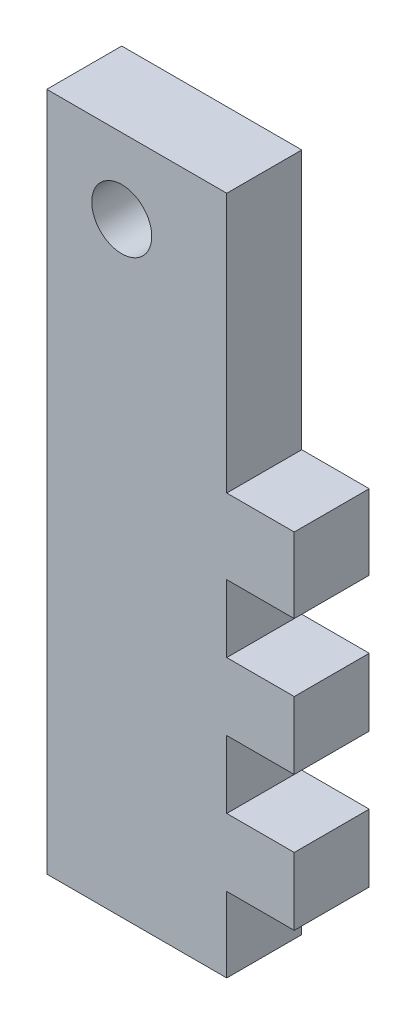
ISO-10303-21;
HEADER;
FILE_DESCRIPTION(('STEP AP214'),'2;1');
FILE_NAME('part.step','',(''),(''),'','','');
FILE_SCHEMA(('AUTOMOTIVE_DESIGN { 1 0 10303 214 1 1 1 1 }'));
ENDSEC;
DATA;
#1=APPLICATION_CONTEXT('core data for automotive mechanical design processes');
#2=APPLICATION_PROTOCOL_DEFINITION('international standard','automotive_design',2000,#1);
#3=PRODUCT_CONTEXT('',#1,'mechanical');
#4=PRODUCT('Part','Part','',(#3));
#5=PRODUCT_RELATED_PRODUCT_CATEGORY('part','',(#4));
#6=PRODUCT_DEFINITION_FORMATION('','',#4);
#7=PRODUCT_DEFINITION_CONTEXT('part definition',#1,'design');
#8=PRODUCT_DEFINITION('design','',#6,#7);
#9=PRODUCT_DEFINITION_SHAPE('','',#8);
#10=(LENGTH_UNIT() NAMED_UNIT(*) SI_UNIT(.MILLI.,.METRE.));
#11=(NAMED_UNIT(*) PLANE_ANGLE_UNIT() SI_UNIT($,.RADIAN.));
#12=(NAMED_UNIT(*) SI_UNIT($,.STERADIAN.) SOLID_ANGLE_UNIT());
#13=UNCERTAINTY_MEASURE_WITH_UNIT(LENGTH_MEASURE(1.E-05),#10,'distance_accuracy_value','');
#14=(GEOMETRIC_REPRESENTATION_CONTEXT(3) GLOBAL_UNCERTAINTY_ASSIGNED_CONTEXT((#13)) GLOBAL_UNIT_ASSIGNED_CONTEXT((#10,
#11,#12)) REPRESENTATION_CONTEXT('',''));
#15=CARTESIAN_POINT('',(0.,0.,0.));
#16=DIRECTION('',(0.,0.,1.));
#17=DIRECTION('',(1.,0.,0.));
#18=AXIS2_PLACEMENT_3D('',#15,#16,#17);
#19=CARTESIAN_POINT('',(0.,0.,5.));
#20=DIRECTION('',(0.,0.,-1.));
#21=DIRECTION('',(-1.,0.,0.));
#22=AXIS2_PLACEMENT_3D('',#19,#20,#21);
#23=PLANE('',#22);
#24=DIRECTION('',(-1.,0.,0.));
#25=VECTOR('',#24,1.);
#26=CARTESIAN_POINT('',(15.7977526997928,0.845653602046623,5.));
#27=LINE('',#26,#25);
#28=CARTESIAN_POINT('',(15.7977526997928,0.845653602046623,5.));
#29=VERTEX_POINT('',#28);
#30=CARTESIAN_POINT('',(11.2977546997928,0.845653602046623,5.));
#31=VERTEX_POINT('',#30);
#32=EDGE_CURVE('E210',#29,#31,#27,.T.);
#33=ORIENTED_EDGE('',*,*,#32,.T.);
#34=DIRECTION('',(0.,1.,0.));
#35=VECTOR('',#34,1.);
#36=CARTESIAN_POINT('',(11.2977546997928,0.845653602046623,5.));
#37=LINE('',#36,#35);
#38=CARTESIAN_POINT('',(11.2977546997928,18.1551016020466,5.));
#39=VERTEX_POINT('',#38);
#40=EDGE_CURVE('E117',#31,#39,#37,.T.);
#41=ORIENTED_EDGE('',*,*,#40,.T.);
#42=DIRECTION('',(-1.,0.,0.));
#43=VECTOR('',#42,1.);
#44=CARTESIAN_POINT('',(11.2977546997928,18.1551016020466,5.));
#45=LINE('',#44,#43);
#46=CARTESIAN_POINT('',(-0.702245300207231,18.1551016020466,5.));
#47=VERTEX_POINT('',#46);
#48=EDGE_CURVE('E249',#39,#47,#45,.T.);
#49=ORIENTED_EDGE('',*,*,#48,.T.);
#50=DIRECTION('',(0.,-1.,0.));
#51=VECTOR('',#50,1.);
#52=CARTESIAN_POINT('',(-0.702245300207231,18.1551016020466,5.));
#53=LINE('',#52,#51);
#54=CARTESIAN_POINT('',(-0.702245300207231,-27.1543463979534,5.));
#55=VERTEX_POINT('',#54);
#56=EDGE_CURVE('E267',#47,#55,#53,.T.);
#57=ORIENTED_EDGE('',*,*,#56,.T.);
#58=DIRECTION('',(1.,0.,0.));
#59=VECTOR('',#58,1.);
#60=CARTESIAN_POINT('',(-0.702245300207231,-27.1543463979534,5.));
#61=LINE('',#60,#59);
#62=CARTESIAN_POINT('',(11.2977546997928,-27.1543463979534,5.));
#63=VERTEX_POINT('',#62);
#64=EDGE_CURVE('E264',#55,#63,#61,.T.);
#65=ORIENTED_EDGE('',*,*,#64,.T.);
#66=DIRECTION('',(0.,1.,0.));
#67=VECTOR('',#66,1.);
#68=CARTESIAN_POINT('',(11.2977546997928,-27.1543463979534,5.));
#69=LINE('',#68,#67);
#70=CARTESIAN_POINT('',(11.2977546997928,-22.1543463979534,5.));
#71=VERTEX_POINT('',#70);
#72=EDGE_CURVE('E266',#63,#71,#69,.T.);
#73=ORIENTED_EDGE('',*,*,#72,.T.);
#74=DIRECTION('',(1.,0.,0.));
#75=VECTOR('',#74,1.);
#76=CARTESIAN_POINT('',(15.7977526997928,-22.1543463979534,5.));
#77=LINE('',#76,#75);
#78=CARTESIAN_POINT('',(15.7977526997928,-22.1543463979534,5.));
#79=VERTEX_POINT('',#78);
#80=EDGE_CURVE('E269',#71,#79,#77,.T.);
#81=ORIENTED_EDGE('',*,*,#80,.T.);
#82=DIRECTION('',(0.,1.,0.));
#83=VECTOR('',#82,1.);
#84=CARTESIAN_POINT('',(15.7977526997928,-22.1543463979534,5.));
#85=LINE('',#84,#83);
#86=CARTESIAN_POINT('',(15.7977526997928,-17.6543463979534,5.));
#87=VERTEX_POINT('',#86);
#88=EDGE_CURVE('E275',#79,#87,#85,.T.);
#89=ORIENTED_EDGE('',*,*,#88,.T.);
#90=DIRECTION('',(-1.,0.,0.));
#91=VECTOR('',#90,1.);
#92=CARTESIAN_POINT('',(15.7977526997928,-17.6543463979534,5.));
#93=LINE('',#92,#91);
#94=CARTESIAN_POINT('',(11.2977546997928,-17.6543463979534,5.));
#95=VERTEX_POINT('',#94);
#96=EDGE_CURVE('E277',#87,#95,#93,.T.);
#97=ORIENTED_EDGE('',*,*,#96,.T.);
#98=DIRECTION('',(0.,1.,0.));
#99=VECTOR('',#98,1.);
#100=CARTESIAN_POINT('',(11.2977546997928,-17.6543463979534,5.));
#101=LINE('',#100,#99);
#102=CARTESIAN_POINT('',(11.2977546997928,-13.1543463979534,5.));
#103=VERTEX_POINT('',#102);
#104=EDGE_CURVE('E279',#95,#103,#101,.T.);
#105=ORIENTED_EDGE('',*,*,#104,.T.);
#106=DIRECTION('',(1.,0.,0.));
#107=VECTOR('',#106,1.);
#108=CARTESIAN_POINT('',(15.7977526997928,-13.1543463979534,5.));
#109=LINE('',#108,#107);
#110=CARTESIAN_POINT('',(15.7977526997928,-13.1543463979534,5.));
#111=VERTEX_POINT('',#110);
#112=EDGE_CURVE('E281',#103,#111,#109,.T.);
#113=ORIENTED_EDGE('',*,*,#112,.T.);
#114=DIRECTION('',(0.,1.,0.));
#115=VECTOR('',#114,1.);
#116=CARTESIAN_POINT('',(15.7977526997928,-13.1543463979534,5.));
#117=LINE('',#116,#115);
#118=CARTESIAN_POINT('',(15.7977526997928,-8.65434639795339,5.));
#119=VERTEX_POINT('',#118);
#120=EDGE_CURVE('E283',#111,#119,#117,.T.);
#121=ORIENTED_EDGE('',*,*,#120,.T.);
#122=DIRECTION('',(-1.,0.,0.));
#123=VECTOR('',#122,1.);
#124=CARTESIAN_POINT('',(15.7977526997928,-8.65434639795339,5.));
#125=LINE('',#124,#123);
#126=CARTESIAN_POINT('',(11.2977546997928,-8.65434639795339,5.));
#127=VERTEX_POINT('',#126);
#128=EDGE_CURVE('E160',#119,#127,#125,.T.);
#129=ORIENTED_EDGE('',*,*,#128,.T.);
#130=DIRECTION('',(0.,1.,0.));
#131=VECTOR('',#130,1.);
#132=CARTESIAN_POINT('',(11.2977546997928,-8.65434639795339,5.));
#133=LINE('',#132,#131);
#134=CARTESIAN_POINT('',(11.2977546997928,-4.15434639795338,5.));
#135=VERTEX_POINT('',#134);
#136=EDGE_CURVE('E154',#127,#135,#133,.T.);
#137=ORIENTED_EDGE('',*,*,#136,.T.);
#138=DIRECTION('',(1.,0.,0.));
#139=VECTOR('',#138,1.);
#140=CARTESIAN_POINT('',(15.7977526997928,-4.15434639795338,5.));
#141=LINE('',#140,#139);
#142=CARTESIAN_POINT('',(15.7977526997928,-4.15434639795338,5.));
#143=VERTEX_POINT('',#142);
#144=EDGE_CURVE('E158',#135,#143,#141,.T.);
#145=ORIENTED_EDGE('',*,*,#144,.T.);
#146=DIRECTION('',(0.,1.,0.));
#147=VECTOR('',#146,1.);
#148=CARTESIAN_POINT('',(15.7977526997928,-4.15434639795338,5.));
#149=LINE('',#148,#147);
#150=EDGE_CURVE('E50',#143,#29,#149,.T.);
#151=ORIENTED_EDGE('',*,*,#150,.T.);
#152=EDGE_LOOP('',(#33,#41,#49,#57,#65,#73,#81,#89,#97,#105,#113,#121,#129,#137,#145,#151));
#153=FACE_BOUND('',#152,.T.);
#154=CARTESIAN_POINT('',(4.29775469979277,13.1587026020466,5.));
#155=DIRECTION('',(0.,0.,1.));
#156=DIRECTION('',(1.,0.,0.));
#157=AXIS2_PLACEMENT_3D('',#154,#155,#156);
#158=CIRCLE('',#157,2.);
#159=CARTESIAN_POINT('',(6.29775469979277,13.1587026020466,5.));
#160=VERTEX_POINT('',#159);
#161=EDGE_CURVE('E182',#160,#160,#158,.T.);
#162=ORIENTED_EDGE('',*,*,#161,.F.);
#163=EDGE_LOOP('',(#162));
#164=FACE_BOUND('',#163,.T.);
#165=ADVANCED_FACE('F33',(#153,#164),#23,.F.);
#166=CARTESIAN_POINT('',(0.,0.,0.));
#167=DIRECTION('',(0.,0.,-1.));
#168=DIRECTION('',(-1.,0.,0.));
#169=AXIS2_PLACEMENT_3D('',#166,#167,#168);
#170=PLANE('',#169);
#171=DIRECTION('',(-1.,0.,0.));
#172=VECTOR('',#171,1.);
#173=CARTESIAN_POINT('',(15.7977526997928,0.845653602046623,0.));
#174=LINE('',#173,#172);
#175=CARTESIAN_POINT('',(15.7977526997928,0.845653602046623,0.));
#176=VERTEX_POINT('',#175);
#177=CARTESIAN_POINT('',(11.2977546997928,0.845653602046623,0.));
#178=VERTEX_POINT('',#177);
#179=EDGE_CURVE('E178',#176,#178,#174,.T.);
#180=ORIENTED_EDGE('',*,*,#179,.F.);
#181=DIRECTION('',(0.,1.,0.));
#182=VECTOR('',#181,1.);
#183=CARTESIAN_POINT('',(15.7977526997928,-4.15434639795338,0.));
#184=LINE('',#183,#182);
#185=CARTESIAN_POINT('',(15.7977526997928,-4.15434639795338,0.));
#186=VERTEX_POINT('',#185);
#187=EDGE_CURVE('E109',#186,#176,#184,.T.);
#188=ORIENTED_EDGE('',*,*,#187,.F.);
#189=DIRECTION('',(1.,0.,0.));
#190=VECTOR('',#189,1.);
#191=CARTESIAN_POINT('',(15.7977526997928,-4.15434639795338,0.));
#192=LINE('',#191,#190);
#193=CARTESIAN_POINT('',(11.2977546997928,-4.15434639795338,0.));
#194=VERTEX_POINT('',#193);
#195=EDGE_CURVE('E103',#194,#186,#192,.T.);
#196=ORIENTED_EDGE('',*,*,#195,.F.);
#197=DIRECTION('',(0.,1.,0.));
#198=VECTOR('',#197,1.);
#199=CARTESIAN_POINT('',(11.2977546997928,-8.65434639795339,0.));
#200=LINE('',#199,#198);
#201=CARTESIAN_POINT('',(11.2977546997928,-8.65434639795339,0.));
#202=VERTEX_POINT('',#201);
#203=EDGE_CURVE('E168',#202,#194,#200,.T.);
#204=ORIENTED_EDGE('',*,*,#203,.F.);
#205=DIRECTION('',(-1.,0.,0.));
#206=VECTOR('',#205,1.);
#207=CARTESIAN_POINT('',(15.7977526997928,-8.65434639795339,0.));
#208=LINE('',#207,#206);
#209=CARTESIAN_POINT('',(15.7977526997928,-8.65434639795339,0.));
#210=VERTEX_POINT('',#209);
#211=EDGE_CURVE('E205',#210,#202,#208,.T.);
#212=ORIENTED_EDGE('',*,*,#211,.F.);
#213=DIRECTION('',(0.,1.,0.));
#214=VECTOR('',#213,1.);
#215=CARTESIAN_POINT('',(15.7977526997928,-13.1543463979534,0.));
#216=LINE('',#215,#214);
#217=CARTESIAN_POINT('',(15.7977526997928,-13.1543463979534,0.));
#218=VERTEX_POINT('',#217);
#219=EDGE_CURVE('E203',#218,#210,#216,.T.);
#220=ORIENTED_EDGE('',*,*,#219,.F.);
#221=DIRECTION('',(1.,0.,0.));
#222=VECTOR('',#221,1.);
#223=CARTESIAN_POINT('',(15.7977526997928,-13.1543463979534,0.));
#224=LINE('',#223,#222);
#225=CARTESIAN_POINT('',(11.2977546997928,-13.1543463979534,0.));
#226=VERTEX_POINT('',#225);
#227=EDGE_CURVE('E201',#226,#218,#224,.T.);
#228=ORIENTED_EDGE('',*,*,#227,.F.);
#229=DIRECTION('',(0.,1.,0.));
#230=VECTOR('',#229,1.);
#231=CARTESIAN_POINT('',(11.2977546997928,-17.6543463979534,0.));
#232=LINE('',#231,#230);
#233=CARTESIAN_POINT('',(11.2977546997928,-17.6543463979534,0.));
#234=VERTEX_POINT('',#233);
#235=EDGE_CURVE('E199',#234,#226,#232,.T.);
#236=ORIENTED_EDGE('',*,*,#235,.F.);
#237=DIRECTION('',(-1.,0.,0.));
#238=VECTOR('',#237,1.);
#239=CARTESIAN_POINT('',(15.7977526997928,-17.6543463979534,0.));
#240=LINE('',#239,#238);
#241=CARTESIAN_POINT('',(15.7977526997928,-17.6543463979534,0.));
#242=VERTEX_POINT('',#241);
#243=EDGE_CURVE('E197',#242,#234,#240,.T.);
#244=ORIENTED_EDGE('',*,*,#243,.F.);
#245=DIRECTION('',(0.,1.,0.));
#246=VECTOR('',#245,1.);
#247=CARTESIAN_POINT('',(15.7977526997928,-22.1543463979534,0.));
#248=LINE('',#247,#246);
#249=CARTESIAN_POINT('',(15.7977526997928,-22.1543463979534,0.));
#250=VERTEX_POINT('',#249);
#251=EDGE_CURVE('E195',#250,#242,#248,.T.);
#252=ORIENTED_EDGE('',*,*,#251,.F.);
#253=DIRECTION('',(1.,0.,0.));
#254=VECTOR('',#253,1.);
#255=CARTESIAN_POINT('',(15.7977526997928,-22.1543463979534,0.));
#256=LINE('',#255,#254);
#257=CARTESIAN_POINT('',(11.2977546997928,-22.1543463979534,0.));
#258=VERTEX_POINT('',#257);
#259=EDGE_CURVE('E193',#258,#250,#256,.T.);
#260=ORIENTED_EDGE('',*,*,#259,.F.);
#261=DIRECTION('',(0.,1.,0.));
#262=VECTOR('',#261,1.);
#263=CARTESIAN_POINT('',(11.2977546997928,-27.1543463979534,0.));
#264=LINE('',#263,#262);
#265=CARTESIAN_POINT('',(11.2977546997928,-27.1543463979534,0.));
#266=VERTEX_POINT('',#265);
#267=EDGE_CURVE('E191',#266,#258,#264,.T.);
#268=ORIENTED_EDGE('',*,*,#267,.F.);
#269=DIRECTION('',(1.,0.,0.));
#270=VECTOR('',#269,1.);
#271=CARTESIAN_POINT('',(-0.702245300207231,-27.1543463979534,0.));
#272=LINE('',#271,#270);
#273=CARTESIAN_POINT('',(-0.702245300207231,-27.1543463979534,0.));
#274=VERTEX_POINT('',#273);
#275=EDGE_CURVE('E189',#274,#266,#272,.T.);
#276=ORIENTED_EDGE('',*,*,#275,.F.);
#277=DIRECTION('',(0.,-1.,0.));
#278=VECTOR('',#277,1.);
#279=CARTESIAN_POINT('',(-0.702245300207231,5.84565360204661,0.));
#280=LINE('',#279,#278);
#281=CARTESIAN_POINT('',(-0.702245300207231,18.1551016020466,0.));
#282=VERTEX_POINT('',#281);
#283=EDGE_CURVE('E187',#282,#274,#280,.T.);
#284=ORIENTED_EDGE('',*,*,#283,.F.);
#285=DIRECTION('',(-1.,0.,0.));
#286=VECTOR('',#285,1.);
#287=CARTESIAN_POINT('',(11.2977546997928,18.1551016020466,0.));
#288=LINE('',#287,#286);
#289=CARTESIAN_POINT('',(11.2977546997928,18.1551016020466,0.));
#290=VERTEX_POINT('',#289);
#291=EDGE_CURVE('E184',#290,#282,#288,.T.);
#292=ORIENTED_EDGE('',*,*,#291,.F.);
#293=DIRECTION('',(0.,1.,0.));
#294=VECTOR('',#293,1.);
#295=CARTESIAN_POINT('',(11.2977546997928,5.84565360204661,0.));
#296=LINE('',#295,#294);
#297=EDGE_CURVE('E181',#178,#290,#296,.T.);
#298=ORIENTED_EDGE('',*,*,#297,.F.);
#299=EDGE_LOOP('',(#180,#188,#196,#204,#212,#220,#228,#236,#244,#252,#260,#268,#276,#284,#292,#298));
#300=FACE_BOUND('',#299,.T.);
#301=CARTESIAN_POINT('',(4.29775469979277,13.1587026020466,0.));
#302=DIRECTION('',(0.,0.,1.));
#303=DIRECTION('',(1.,0.,0.));
#304=AXIS2_PLACEMENT_3D('',#301,#302,#303);
#305=CIRCLE('',#304,2.);
#306=CARTESIAN_POINT('',(6.29775469979277,13.1587026020466,0.));
#307=VERTEX_POINT('',#306);
#308=EDGE_CURVE('E488',#307,#307,#305,.T.);
#309=ORIENTED_EDGE('',*,*,#308,.T.);
#310=EDGE_LOOP('',(#309));
#311=FACE_BOUND('',#310,.T.);
#312=ADVANCED_FACE('F252',(#300,#311),#170,.T.);
#313=CARTESIAN_POINT('',(15.7977526997928,0.845653602046623,5.));
#314=DIRECTION('',(0.,-1.,0.));
#315=DIRECTION('',(0.,0.,-1.));
#316=AXIS2_PLACEMENT_3D('',#313,#314,#315);
#317=PLANE('',#316);
#318=ORIENTED_EDGE('',*,*,#179,.T.);
#319=DIRECTION('',(0.,0.,-1.));
#320=VECTOR('',#319,1.);
#321=CARTESIAN_POINT('',(11.2977546997928,0.845653602046623,5.));
#322=LINE('',#321,#320);
#323=EDGE_CURVE('E11',#31,#178,#322,.T.);
#324=ORIENTED_EDGE('',*,*,#323,.F.);
#325=ORIENTED_EDGE('',*,*,#32,.F.);
#326=DIRECTION('',(0.,0.,-1.));
#327=VECTOR('',#326,1.);
#328=CARTESIAN_POINT('',(15.7977526997928,0.845653602046623,5.));
#329=LINE('',#328,#327);
#330=EDGE_CURVE('E174',#29,#176,#329,.T.);
#331=ORIENTED_EDGE('',*,*,#330,.T.);
#332=EDGE_LOOP('',(#318,#324,#325,#331));
#333=FACE_BOUND('',#332,.T.);
#334=ADVANCED_FACE('F35',(#333),#317,.F.);
#335=CARTESIAN_POINT('',(11.2977546997928,5.84565360204661,5.));
#336=DIRECTION('',(-1.,0.,0.));
#337=DIRECTION('',(0.,0.,1.));
#338=AXIS2_PLACEMENT_3D('',#335,#336,#337);
#339=PLANE('',#338);
#340=ORIENTED_EDGE('',*,*,#297,.T.);
#341=DIRECTION('',(0.,0.,-1.));
#342=VECTOR('',#341,1.);
#343=CARTESIAN_POINT('',(11.2977546997928,18.1551016020466,5.));
#344=LINE('',#343,#342);
#345=EDGE_CURVE('E42',#39,#290,#344,.T.);
#346=ORIENTED_EDGE('',*,*,#345,.F.);
#347=ORIENTED_EDGE('',*,*,#40,.F.);
#348=ORIENTED_EDGE('',*,*,#323,.T.);
#349=EDGE_LOOP('',(#340,#346,#347,#348));
#350=FACE_BOUND('',#349,.T.);
#351=ADVANCED_FACE('F317',(#350),#339,.F.);
#352=CARTESIAN_POINT('',(11.2977546997928,18.1551016020466,5.));
#353=DIRECTION('',(0.,-1.,0.));
#354=DIRECTION('',(0.,0.,-1.));
#355=AXIS2_PLACEMENT_3D('',#352,#353,#354);
#356=PLANE('',#355);
#357=ORIENTED_EDGE('',*,*,#291,.T.);
#358=DIRECTION('',(0.,0.,-1.));
#359=VECTOR('',#358,1.);
#360=CARTESIAN_POINT('',(-0.702245300207231,18.1551016020466,5.));
#361=LINE('',#360,#359);
#362=EDGE_CURVE('E241',#47,#282,#361,.T.);
#363=ORIENTED_EDGE('',*,*,#362,.F.);
#364=ORIENTED_EDGE('',*,*,#48,.F.);
#365=ORIENTED_EDGE('',*,*,#345,.T.);
#366=EDGE_LOOP('',(#357,#363,#364,#365));
#367=FACE_BOUND('',#366,.T.);
#368=ADVANCED_FACE('F247',(#367),#356,.F.);
#369=CARTESIAN_POINT('',(-0.702245300207231,5.84565360204661,5.));
#370=DIRECTION('',(1.,0.,0.));
#371=DIRECTION('',(0.,0.,-1.));
#372=AXIS2_PLACEMENT_3D('',#369,#370,#371);
#373=PLANE('',#372);
#374=ORIENTED_EDGE('',*,*,#283,.T.);
#375=DIRECTION('',(0.,0.,-1.));
#376=VECTOR('',#375,1.);
#377=CARTESIAN_POINT('',(-0.702245300207231,-27.1543463979534,5.));
#378=LINE('',#377,#376);
#379=EDGE_CURVE('E238',#55,#274,#378,.T.);
#380=ORIENTED_EDGE('',*,*,#379,.F.);
#381=ORIENTED_EDGE('',*,*,#56,.F.);
#382=ORIENTED_EDGE('',*,*,#362,.T.);
#383=EDGE_LOOP('',(#374,#380,#381,#382));
#384=FACE_BOUND('',#383,.T.);
#385=ADVANCED_FACE('F258',(#384),#373,.F.);
#386=CARTESIAN_POINT('',(-0.702245300207231,-27.1543463979534,5.));
#387=DIRECTION('',(0.,1.,0.));
#388=DIRECTION('',(0.,0.,1.));
#389=AXIS2_PLACEMENT_3D('',#386,#387,#388);
#390=PLANE('',#389);
#391=ORIENTED_EDGE('',*,*,#275,.T.);
#392=DIRECTION('',(0.,0.,-1.));
#393=VECTOR('',#392,1.);
#394=CARTESIAN_POINT('',(11.2977546997928,-27.1543463979534,5.));
#395=LINE('',#394,#393);
#396=EDGE_CURVE('E235',#63,#266,#395,.T.);
#397=ORIENTED_EDGE('',*,*,#396,.F.);
#398=ORIENTED_EDGE('',*,*,#64,.F.);
#399=ORIENTED_EDGE('',*,*,#379,.T.);
#400=EDGE_LOOP('',(#391,#397,#398,#399));
#401=FACE_BOUND('',#400,.T.);
#402=ADVANCED_FACE('F262',(#401),#390,.F.);
#403=CARTESIAN_POINT('',(11.2977546997928,-27.1543463979534,5.));
#404=DIRECTION('',(-1.,0.,0.));
#405=DIRECTION('',(0.,0.,1.));
#406=AXIS2_PLACEMENT_3D('',#403,#404,#405);
#407=PLANE('',#406);
#408=ORIENTED_EDGE('',*,*,#267,.T.);
#409=DIRECTION('',(0.,0.,-1.));
#410=VECTOR('',#409,1.);
#411=CARTESIAN_POINT('',(11.2977546997928,-22.1543463979534,5.));
#412=LINE('',#411,#410);
#413=EDGE_CURVE('E232',#71,#258,#412,.T.);
#414=ORIENTED_EDGE('',*,*,#413,.F.);
#415=ORIENTED_EDGE('',*,*,#72,.F.);
#416=ORIENTED_EDGE('',*,*,#396,.T.);
#417=EDGE_LOOP('',(#408,#414,#415,#416));
#418=FACE_BOUND('',#417,.T.);
#419=ADVANCED_FACE('F330',(#418),#407,.F.);
#420=CARTESIAN_POINT('',(15.7977526997928,-22.1543463979534,5.));
#421=DIRECTION('',(0.,1.,0.));
#422=DIRECTION('',(0.,0.,1.));
#423=AXIS2_PLACEMENT_3D('',#420,#421,#422);
#424=PLANE('',#423);
#425=ORIENTED_EDGE('',*,*,#259,.T.);
#426=DIRECTION('',(0.,0.,-1.));
#427=VECTOR('',#426,1.);
#428=CARTESIAN_POINT('',(15.7977526997928,-22.1543463979534,5.));
#429=LINE('',#428,#427);
#430=EDGE_CURVE('E229',#79,#250,#429,.T.);
#431=ORIENTED_EDGE('',*,*,#430,.F.);
#432=ORIENTED_EDGE('',*,*,#80,.F.);
#433=ORIENTED_EDGE('',*,*,#413,.T.);
#434=EDGE_LOOP('',(#425,#431,#432,#433));
#435=FACE_BOUND('',#434,.T.);
#436=ADVANCED_FACE('F333',(#435),#424,.F.);
#437=CARTESIAN_POINT('',(15.7977526997928,-22.1543463979534,5.));
#438=DIRECTION('',(-1.,0.,0.));
#439=DIRECTION('',(0.,0.,1.));
#440=AXIS2_PLACEMENT_3D('',#437,#438,#439);
#441=PLANE('',#440);
#442=ORIENTED_EDGE('',*,*,#251,.T.);
#443=DIRECTION('',(0.,0.,-1.));
#444=VECTOR('',#443,1.);
#445=CARTESIAN_POINT('',(15.7977526997928,-17.6543463979534,5.));
#446=LINE('',#445,#444);
#447=EDGE_CURVE('E226',#87,#242,#446,.T.);
#448=ORIENTED_EDGE('',*,*,#447,.F.);
#449=ORIENTED_EDGE('',*,*,#88,.F.);
#450=ORIENTED_EDGE('',*,*,#430,.T.);
#451=EDGE_LOOP('',(#442,#448,#449,#450));
#452=FACE_BOUND('',#451,.T.);
#453=ADVANCED_FACE('F337',(#452),#441,.F.);
#454=CARTESIAN_POINT('',(15.7977526997928,-17.6543463979534,5.));
#455=DIRECTION('',(0.,-1.,0.));
#456=DIRECTION('',(0.,0.,-1.));
#457=AXIS2_PLACEMENT_3D('',#454,#455,#456);
#458=PLANE('',#457);
#459=ORIENTED_EDGE('',*,*,#243,.T.);
#460=DIRECTION('',(0.,0.,-1.));
#461=VECTOR('',#460,1.);
#462=CARTESIAN_POINT('',(11.2977546997928,-17.6543463979534,5.));
#463=LINE('',#462,#461);
#464=EDGE_CURVE('E223',#95,#234,#463,.T.);
#465=ORIENTED_EDGE('',*,*,#464,.F.);
#466=ORIENTED_EDGE('',*,*,#96,.F.);
#467=ORIENTED_EDGE('',*,*,#447,.T.);
#468=EDGE_LOOP('',(#459,#465,#466,#467));
#469=FACE_BOUND('',#468,.T.);
#470=ADVANCED_FACE('F341',(#469),#458,.F.);
#471=CARTESIAN_POINT('',(11.2977546997928,-17.6543463979534,5.));
#472=DIRECTION('',(-1.,0.,0.));
#473=DIRECTION('',(0.,0.,1.));
#474=AXIS2_PLACEMENT_3D('',#471,#472,#473);
#475=PLANE('',#474);
#476=ORIENTED_EDGE('',*,*,#235,.T.);
#477=DIRECTION('',(0.,0.,-1.));
#478=VECTOR('',#477,1.);
#479=CARTESIAN_POINT('',(11.2977546997928,-13.1543463979534,5.));
#480=LINE('',#479,#478);
#481=EDGE_CURVE('E220',#103,#226,#480,.T.);
#482=ORIENTED_EDGE('',*,*,#481,.F.);
#483=ORIENTED_EDGE('',*,*,#104,.F.);
#484=ORIENTED_EDGE('',*,*,#464,.T.);
#485=EDGE_LOOP('',(#476,#482,#483,#484));
#486=FACE_BOUND('',#485,.T.);
#487=ADVANCED_FACE('F345',(#486),#475,.F.);
#488=CARTESIAN_POINT('',(15.7977526997928,-13.1543463979534,5.));
#489=DIRECTION('',(0.,1.,0.));
#490=DIRECTION('',(0.,0.,1.));
#491=AXIS2_PLACEMENT_3D('',#488,#489,#490);
#492=PLANE('',#491);
#493=ORIENTED_EDGE('',*,*,#227,.T.);
#494=DIRECTION('',(0.,0.,-1.));
#495=VECTOR('',#494,1.);
#496=CARTESIAN_POINT('',(15.7977526997928,-13.1543463979534,5.));
#497=LINE('',#496,#495);
#498=EDGE_CURVE('E217',#111,#218,#497,.T.);
#499=ORIENTED_EDGE('',*,*,#498,.F.);
#500=ORIENTED_EDGE('',*,*,#112,.F.);
#501=ORIENTED_EDGE('',*,*,#481,.T.);
#502=EDGE_LOOP('',(#493,#499,#500,#501));
#503=FACE_BOUND('',#502,.T.);
#504=ADVANCED_FACE('F349',(#503),#492,.F.);
#505=CARTESIAN_POINT('',(15.7977526997928,-13.1543463979534,5.));
#506=DIRECTION('',(-1.,0.,0.));
#507=DIRECTION('',(0.,0.,1.));
#508=AXIS2_PLACEMENT_3D('',#505,#506,#507);
#509=PLANE('',#508);
#510=ORIENTED_EDGE('',*,*,#219,.T.);
#511=DIRECTION('',(0.,0.,-1.));
#512=VECTOR('',#511,1.);
#513=CARTESIAN_POINT('',(15.7977526997928,-8.65434639795339,5.));
#514=LINE('',#513,#512);
#515=EDGE_CURVE('E214',#119,#210,#514,.T.);
#516=ORIENTED_EDGE('',*,*,#515,.F.);
#517=ORIENTED_EDGE('',*,*,#120,.F.);
#518=ORIENTED_EDGE('',*,*,#498,.T.);
#519=EDGE_LOOP('',(#510,#516,#517,#518));
#520=FACE_BOUND('',#519,.T.);
#521=ADVANCED_FACE('F289',(#520),#509,.F.);
#522=CARTESIAN_POINT('',(15.7977526997928,-8.65434639795339,5.));
#523=DIRECTION('',(0.,-1.,0.));
#524=DIRECTION('',(0.,0.,-1.));
#525=AXIS2_PLACEMENT_3D('',#522,#523,#524);
#526=PLANE('',#525);
#527=ORIENTED_EDGE('',*,*,#211,.T.);
#528=DIRECTION('',(0.,0.,-1.));
#529=VECTOR('',#528,1.);
#530=CARTESIAN_POINT('',(11.2977546997928,-8.65434639795339,5.));
#531=LINE('',#530,#529);
#532=EDGE_CURVE('E169',#127,#202,#531,.T.);
#533=ORIENTED_EDGE('',*,*,#532,.F.);
#534=ORIENTED_EDGE('',*,*,#128,.F.);
#535=ORIENTED_EDGE('',*,*,#515,.T.);
#536=EDGE_LOOP('',(#527,#533,#534,#535));
#537=FACE_BOUND('',#536,.T.);
#538=ADVANCED_FACE('F293',(#537),#526,.F.);
#539=CARTESIAN_POINT('',(11.2977546997928,-8.65434639795339,5.));
#540=DIRECTION('',(-1.,0.,0.));
#541=DIRECTION('',(0.,0.,1.));
#542=AXIS2_PLACEMENT_3D('',#539,#540,#541);
#543=PLANE('',#542);
#544=ORIENTED_EDGE('',*,*,#203,.T.);
#545=DIRECTION('',(0.,0.,-1.));
#546=VECTOR('',#545,1.);
#547=CARTESIAN_POINT('',(11.2977546997928,-4.15434639795338,5.));
#548=LINE('',#547,#546);
#549=EDGE_CURVE('E165',#135,#194,#548,.T.);
#550=ORIENTED_EDGE('',*,*,#549,.F.);
#551=ORIENTED_EDGE('',*,*,#136,.F.);
#552=ORIENTED_EDGE('',*,*,#532,.T.);
#553=EDGE_LOOP('',(#544,#550,#551,#552));
#554=FACE_BOUND('',#553,.T.);
#555=ADVANCED_FACE('F166',(#554),#543,.F.);
#556=CARTESIAN_POINT('',(15.7977526997928,-4.15434639795338,5.));
#557=DIRECTION('',(0.,1.,0.));
#558=DIRECTION('',(0.,0.,1.));
#559=AXIS2_PLACEMENT_3D('',#556,#557,#558);
#560=PLANE('',#559);
#561=ORIENTED_EDGE('',*,*,#195,.T.);
#562=DIRECTION('',(0.,0.,-1.));
#563=VECTOR('',#562,1.);
#564=CARTESIAN_POINT('',(15.7977526997928,-4.15434639795338,5.));
#565=LINE('',#564,#563);
#566=EDGE_CURVE('E170',#143,#186,#565,.T.);
#567=ORIENTED_EDGE('',*,*,#566,.F.);
#568=ORIENTED_EDGE('',*,*,#144,.F.);
#569=ORIENTED_EDGE('',*,*,#549,.T.);
#570=EDGE_LOOP('',(#561,#567,#568,#569));
#571=FACE_BOUND('',#570,.T.);
#572=ADVANCED_FACE('F172',(#571),#560,.F.);
#573=CARTESIAN_POINT('',(15.7977526997928,-4.15434639795338,5.));
#574=DIRECTION('',(-1.,0.,0.));
#575=DIRECTION('',(0.,0.,1.));
#576=AXIS2_PLACEMENT_3D('',#573,#574,#575);
#577=PLANE('',#576);
#578=ORIENTED_EDGE('',*,*,#187,.T.);
#579=ORIENTED_EDGE('',*,*,#330,.F.);
#580=ORIENTED_EDGE('',*,*,#150,.F.);
#581=ORIENTED_EDGE('',*,*,#566,.T.);
#582=EDGE_LOOP('',(#578,#579,#580,#581));
#583=FACE_BOUND('',#582,.T.);
#584=ADVANCED_FACE('F297',(#583),#577,.F.);
#585=CARTESIAN_POINT('',(4.29775469979277,13.1587026020466,5.));
#586=DIRECTION('',(0.,0.,-1.));
#587=DIRECTION('',(-1.,0.,0.));
#588=AXIS2_PLACEMENT_3D('',#585,#586,#587);
#589=CYLINDRICAL_SURFACE('',#588,2.);
#590=ORIENTED_EDGE('',*,*,#161,.T.);
#591=EDGE_LOOP('',(#590));
#592=FACE_BOUND('',#591,.T.);
#593=ORIENTED_EDGE('',*,*,#308,.F.);
#594=EDGE_LOOP('',(#593));
#595=FACE_BOUND('',#594,.T.);
#596=ADVANCED_FACE('F299',(#592,#595),#589,.F.);
#597=CLOSED_SHELL('',(#165,#312,#334,#351,#368,#385,#402,#419,#436,#453,#470,#487,#504,#521,
#538,#555,#572,#584,#596));
#598=MANIFOLD_SOLID_BREP('B2',#597);
#599=ADVANCED_BREP_SHAPE_REPRESENTATION('',(#18,#598),#14);
#600=SHAPE_DEFINITION_REPRESENTATION(#9,#599);
ENDSEC;
END-ISO-10303-21;
